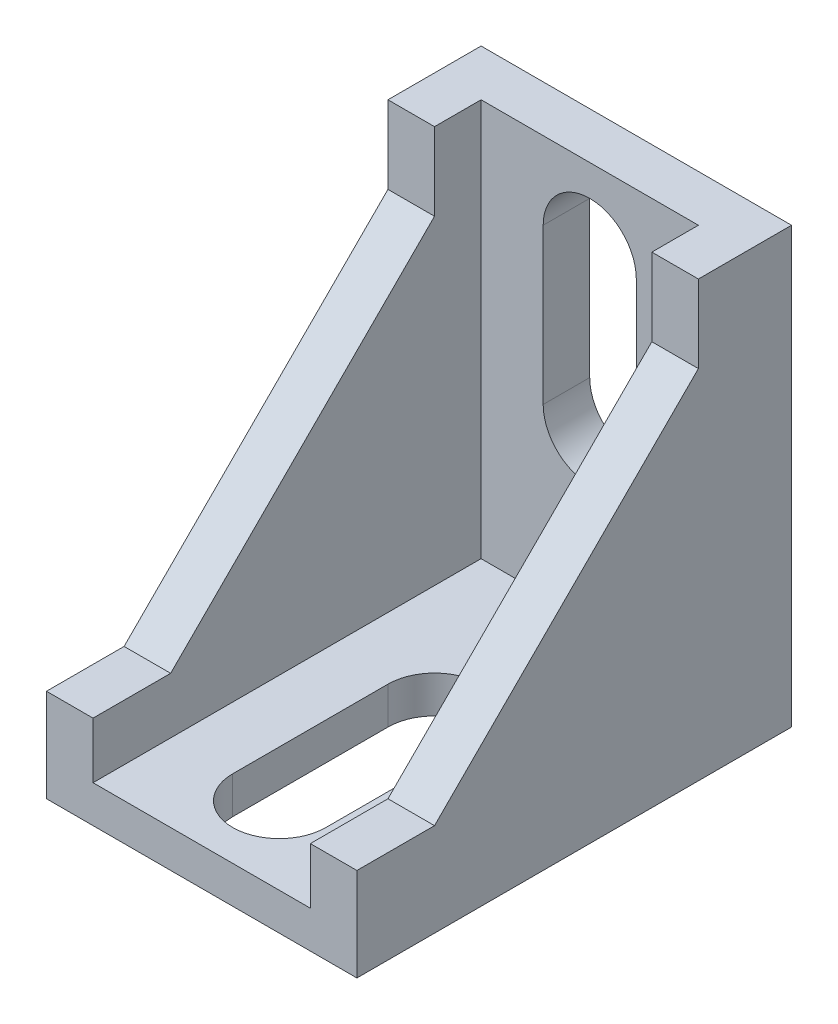
ISO-10303-21;
HEADER;
FILE_DESCRIPTION(('STEP AP214'),'2;1');
FILE_NAME('part.step','',(''),(''),'','','');
FILE_SCHEMA(('AUTOMOTIVE_DESIGN { 1 0 10303 214 1 1 1 1 }'));
ENDSEC;
DATA;
#1=APPLICATION_CONTEXT('core data for automotive mechanical design processes');
#2=APPLICATION_PROTOCOL_DEFINITION('international standard','automotive_design',2000,#1);
#3=PRODUCT_CONTEXT('',#1,'mechanical');
#4=PRODUCT('Part','Part','',(#3));
#5=PRODUCT_RELATED_PRODUCT_CATEGORY('part','',(#4));
#6=PRODUCT_DEFINITION_FORMATION('','',#4);
#7=PRODUCT_DEFINITION_CONTEXT('part definition',#1,'design');
#8=PRODUCT_DEFINITION('design','',#6,#7);
#9=PRODUCT_DEFINITION_SHAPE('','',#8);
#10=(LENGTH_UNIT() NAMED_UNIT(*) SI_UNIT(.MILLI.,.METRE.));
#11=(NAMED_UNIT(*) PLANE_ANGLE_UNIT() SI_UNIT($,.RADIAN.));
#12=(NAMED_UNIT(*) SI_UNIT($,.STERADIAN.) SOLID_ANGLE_UNIT());
#13=UNCERTAINTY_MEASURE_WITH_UNIT(LENGTH_MEASURE(1.E-05),#10,'distance_accuracy_value','');
#14=(GEOMETRIC_REPRESENTATION_CONTEXT(3) GLOBAL_UNCERTAINTY_ASSIGNED_CONTEXT((#13)) GLOBAL_UNIT_ASSIGNED_CONTEXT((#10,
#11,#12)) REPRESENTATION_CONTEXT('',''));
#15=CARTESIAN_POINT('',(0.,0.,0.));
#16=DIRECTION('',(0.,0.,1.));
#17=DIRECTION('',(1.,0.,0.));
#18=AXIS2_PLACEMENT_3D('',#15,#16,#17);
#19=CARTESIAN_POINT('',(-10.,0.,0.));
#20=DIRECTION('',(1.,0.,0.));
#21=DIRECTION('',(0.,1.,0.));
#22=AXIS2_PLACEMENT_3D('',#19,#20,#21);
#23=PLANE('',#22);
#24=DIRECTION('',(0.,-1.,0.));
#25=VECTOR('',#24,1.);
#26=CARTESIAN_POINT('',(-10.,3.,28.));
#27=LINE('',#26,#25);
#28=CARTESIAN_POINT('',(-10.,6.,28.));
#29=VERTEX_POINT('',#28);
#30=CARTESIAN_POINT('',(-10.,0.,28.));
#31=VERTEX_POINT('',#30);
#32=EDGE_CURVE('E315',#29,#31,#27,.T.);
#33=ORIENTED_EDGE('',*,*,#32,.F.);
#34=DIRECTION('',(0.,0.,1.));
#35=VECTOR('',#34,1.);
#36=CARTESIAN_POINT('',(-10.,6.,25.5));
#37=LINE('',#36,#35);
#38=CARTESIAN_POINT('',(-10.,6.,23.));
#39=VERTEX_POINT('',#38);
#40=EDGE_CURVE('E40',#39,#29,#37,.T.);
#41=ORIENTED_EDGE('',*,*,#40,.F.);
#42=DIRECTION('',(0.,-0.707106781186548,0.707106781186548));
#43=VECTOR('',#42,1.);
#44=CARTESIAN_POINT('',(-10.,14.5,14.5));
#45=LINE('',#44,#43);
#46=CARTESIAN_POINT('',(-10.,23.,6.));
#47=VERTEX_POINT('',#46);
#48=EDGE_CURVE('E293',#47,#39,#45,.T.);
#49=ORIENTED_EDGE('',*,*,#48,.F.);
#50=DIRECTION('',(0.,-1.,0.));
#51=VECTOR('',#50,1.);
#52=CARTESIAN_POINT('',(-10.,25.5,6.));
#53=LINE('',#52,#51);
#54=CARTESIAN_POINT('',(-10.,28.,6.));
#55=VERTEX_POINT('',#54);
#56=EDGE_CURVE('E302',#55,#47,#53,.T.);
#57=ORIENTED_EDGE('',*,*,#56,.F.);
#58=DIRECTION('',(0.,0.,1.));
#59=VECTOR('',#58,1.);
#60=CARTESIAN_POINT('',(-10.,28.,3.));
#61=LINE('',#60,#59);
#62=CARTESIAN_POINT('',(-10.,28.,0.));
#63=VERTEX_POINT('',#62);
#64=EDGE_CURVE('E265',#63,#55,#61,.T.);
#65=ORIENTED_EDGE('',*,*,#64,.F.);
#66=DIRECTION('',(0.,1.,0.));
#67=VECTOR('',#66,1.);
#68=CARTESIAN_POINT('',(-10.,14.,0.));
#69=LINE('',#68,#67);
#70=CARTESIAN_POINT('',(-10.,0.,0.));
#71=VERTEX_POINT('',#70);
#72=EDGE_CURVE('E336',#71,#63,#69,.T.);
#73=ORIENTED_EDGE('',*,*,#72,.F.);
#74=DIRECTION('',(0.,0.,-1.));
#75=VECTOR('',#74,1.);
#76=CARTESIAN_POINT('',(-10.,0.,14.));
#77=LINE('',#76,#75);
#78=EDGE_CURVE('E273',#31,#71,#77,.T.);
#79=ORIENTED_EDGE('',*,*,#78,.F.);
#80=EDGE_LOOP('',(#33,#41,#49,#57,#65,#73,#79));
#81=FACE_BOUND('',#80,.T.);
#82=ADVANCED_FACE('F15',(#81),#23,.F.);
#83=CARTESIAN_POINT('',(10.,0.,0.));
#84=DIRECTION('',(1.,0.,0.));
#85=DIRECTION('',(0.,1.,0.));
#86=AXIS2_PLACEMENT_3D('',#83,#84,#85);
#87=PLANE('',#86);
#88=DIRECTION('',(0.,0.,-1.));
#89=VECTOR('',#88,1.);
#90=CARTESIAN_POINT('',(10.,0.,14.));
#91=LINE('',#90,#89);
#92=CARTESIAN_POINT('',(10.,0.,28.));
#93=VERTEX_POINT('',#92);
#94=CARTESIAN_POINT('',(10.,0.,0.));
#95=VERTEX_POINT('',#94);
#96=EDGE_CURVE('E10',#93,#95,#91,.T.);
#97=ORIENTED_EDGE('',*,*,#96,.T.);
#98=DIRECTION('',(0.,1.,0.));
#99=VECTOR('',#98,1.);
#100=CARTESIAN_POINT('',(10.,14.,0.));
#101=LINE('',#100,#99);
#102=CARTESIAN_POINT('',(10.,28.,0.));
#103=VERTEX_POINT('',#102);
#104=EDGE_CURVE('E26',#95,#103,#101,.T.);
#105=ORIENTED_EDGE('',*,*,#104,.T.);
#106=DIRECTION('',(0.,0.,1.));
#107=VECTOR('',#106,1.);
#108=CARTESIAN_POINT('',(10.,28.,3.));
#109=LINE('',#108,#107);
#110=CARTESIAN_POINT('',(10.,28.,6.));
#111=VERTEX_POINT('',#110);
#112=EDGE_CURVE('E291',#103,#111,#109,.T.);
#113=ORIENTED_EDGE('',*,*,#112,.T.);
#114=DIRECTION('',(0.,-1.,0.));
#115=VECTOR('',#114,1.);
#116=CARTESIAN_POINT('',(10.,25.5,6.));
#117=LINE('',#116,#115);
#118=CARTESIAN_POINT('',(10.,23.,6.));
#119=VERTEX_POINT('',#118);
#120=EDGE_CURVE('E287',#111,#119,#117,.T.);
#121=ORIENTED_EDGE('',*,*,#120,.T.);
#122=DIRECTION('',(0.,-0.707106781186548,0.707106781186548));
#123=VECTOR('',#122,1.);
#124=CARTESIAN_POINT('',(10.,14.5,14.5));
#125=LINE('',#124,#123);
#126=CARTESIAN_POINT('',(10.,6.,23.));
#127=VERTEX_POINT('',#126);
#128=EDGE_CURVE('E292',#119,#127,#125,.T.);
#129=ORIENTED_EDGE('',*,*,#128,.T.);
#130=DIRECTION('',(0.,0.,1.));
#131=VECTOR('',#130,1.);
#132=CARTESIAN_POINT('',(10.,6.,25.5));
#133=LINE('',#132,#131);
#134=CARTESIAN_POINT('',(10.,6.,28.));
#135=VERTEX_POINT('',#134);
#136=EDGE_CURVE('E372',#127,#135,#133,.T.);
#137=ORIENTED_EDGE('',*,*,#136,.T.);
#138=DIRECTION('',(0.,-1.,0.));
#139=VECTOR('',#138,1.);
#140=CARTESIAN_POINT('',(10.,3.,28.));
#141=LINE('',#140,#139);
#142=EDGE_CURVE('E358',#135,#93,#141,.T.);
#143=ORIENTED_EDGE('',*,*,#142,.T.);
#144=EDGE_LOOP('',(#97,#105,#113,#121,#129,#137,#143));
#145=FACE_BOUND('',#144,.T.);
#146=ADVANCED_FACE('F386',(#145),#87,.T.);
#147=CARTESIAN_POINT('',(0.,6.,28.));
#148=DIRECTION('',(0.,0.,1.));
#149=DIRECTION('',(1.,0.,0.));
#150=AXIS2_PLACEMENT_3D('',#147,#148,#149);
#151=PLANE('',#150);
#152=DIRECTION('',(1.,0.,0.));
#153=VECTOR('',#152,1.);
#154=CARTESIAN_POINT('',(-8.5,6.,28.));
#155=LINE('',#154,#153);
#156=CARTESIAN_POINT('',(-7.,6.,28.));
#157=VERTEX_POINT('',#156);
#158=EDGE_CURVE('E272',#29,#157,#155,.T.);
#159=ORIENTED_EDGE('',*,*,#158,.F.);
#160=ORIENTED_EDGE('',*,*,#32,.T.);
#161=DIRECTION('',(1.,0.,0.));
#162=VECTOR('',#161,1.);
#163=CARTESIAN_POINT('',(0.,0.,28.));
#164=LINE('',#163,#162);
#165=EDGE_CURVE('E271',#31,#93,#164,.T.);
#166=ORIENTED_EDGE('',*,*,#165,.T.);
#167=ORIENTED_EDGE('',*,*,#142,.F.);
#168=DIRECTION('',(1.,0.,0.));
#169=VECTOR('',#168,1.);
#170=CARTESIAN_POINT('',(8.5,6.,28.));
#171=LINE('',#170,#169);
#172=CARTESIAN_POINT('',(7.,6.,28.));
#173=VERTEX_POINT('',#172);
#174=EDGE_CURVE('E364',#173,#135,#171,.T.);
#175=ORIENTED_EDGE('',*,*,#174,.F.);
#176=DIRECTION('',(0.,1.,0.));
#177=VECTOR('',#176,1.);
#178=CARTESIAN_POINT('',(7.,4.19772658937,28.));
#179=LINE('',#178,#177);
#180=CARTESIAN_POINT('',(7.,2.39545317873,28.));
#181=VERTEX_POINT('',#180);
#182=EDGE_CURVE('E403',#181,#173,#179,.T.);
#183=ORIENTED_EDGE('',*,*,#182,.F.);
#184=DIRECTION('',(1.,0.,0.));
#185=VECTOR('',#184,1.);
#186=CARTESIAN_POINT('',(0.,2.39545317873,28.));
#187=LINE('',#186,#185);
#188=CARTESIAN_POINT('',(-7.,2.39545317873,28.));
#189=VERTEX_POINT('',#188);
#190=EDGE_CURVE('E326',#189,#181,#187,.T.);
#191=ORIENTED_EDGE('',*,*,#190,.F.);
#192=DIRECTION('',(0.,-1.,0.));
#193=VECTOR('',#192,1.);
#194=CARTESIAN_POINT('',(-7.,4.19772658937,28.));
#195=LINE('',#194,#193);
#196=EDGE_CURVE('E363',#157,#189,#195,.T.);
#197=ORIENTED_EDGE('',*,*,#196,.F.);
#198=EDGE_LOOP('',(#159,#160,#166,#167,#175,#183,#191,#197));
#199=FACE_BOUND('',#198,.T.);
#200=ADVANCED_FACE('F402',(#199),#151,.T.);
#201=CARTESIAN_POINT('',(0.,6.,23.));
#202=DIRECTION('',(0.,1.,0.));
#203=DIRECTION('',(1.,0.,0.));
#204=AXIS2_PLACEMENT_3D('',#201,#202,#203);
#205=PLANE('',#204);
#206=DIRECTION('',(1.,0.,0.));
#207=VECTOR('',#206,1.);
#208=CARTESIAN_POINT('',(-8.5,6.,23.));
#209=LINE('',#208,#207);
#210=CARTESIAN_POINT('',(-7.,6.,23.));
#211=VERTEX_POINT('',#210);
#212=EDGE_CURVE('E297',#39,#211,#209,.T.);
#213=ORIENTED_EDGE('',*,*,#212,.F.);
#214=ORIENTED_EDGE('',*,*,#40,.T.);
#215=ORIENTED_EDGE('',*,*,#158,.T.);
#216=DIRECTION('',(0.,0.,-1.));
#217=VECTOR('',#216,1.);
#218=CARTESIAN_POINT('',(-7.,6.,25.5));
#219=LINE('',#218,#217);
#220=EDGE_CURVE('E19',#157,#211,#219,.T.);
#221=ORIENTED_EDGE('',*,*,#220,.T.);
#222=EDGE_LOOP('',(#213,#214,#215,#221));
#223=FACE_BOUND('',#222,.T.);
#224=ADVANCED_FACE('F516',(#223),#205,.T.);
#225=CARTESIAN_POINT('',(0.,6.,23.));
#226=DIRECTION('',(0.,1.,0.));
#227=DIRECTION('',(1.,0.,0.));
#228=AXIS2_PLACEMENT_3D('',#225,#226,#227);
#229=PLANE('',#228);
#230=ORIENTED_EDGE('',*,*,#174,.T.);
#231=ORIENTED_EDGE('',*,*,#136,.F.);
#232=DIRECTION('',(1.,0.,0.));
#233=VECTOR('',#232,1.);
#234=CARTESIAN_POINT('',(8.5,6.,23.));
#235=LINE('',#234,#233);
#236=CARTESIAN_POINT('',(7.,6.,23.));
#237=VERTEX_POINT('',#236);
#238=EDGE_CURVE('E298',#237,#127,#235,.T.);
#239=ORIENTED_EDGE('',*,*,#238,.F.);
#240=DIRECTION('',(0.,0.,-1.));
#241=VECTOR('',#240,1.);
#242=CARTESIAN_POINT('',(7.,6.,25.5));
#243=LINE('',#242,#241);
#244=EDGE_CURVE('E397',#173,#237,#243,.T.);
#245=ORIENTED_EDGE('',*,*,#244,.F.);
#246=EDGE_LOOP('',(#230,#231,#239,#245));
#247=FACE_BOUND('',#246,.T.);
#248=ADVANCED_FACE('F396',(#247),#229,.T.);
#249=CARTESIAN_POINT('',(0.,6.,23.));
#250=DIRECTION('',(0.,-0.707106781186548,-0.707106781186548));
#251=DIRECTION('',(0.,-0.707106781186548,0.707106781186548));
#252=AXIS2_PLACEMENT_3D('',#249,#250,#251);
#253=PLANE('',#252);
#254=DIRECTION('',(0.,0.707106781186548,-0.707106781186548));
#255=VECTOR('',#254,1.);
#256=CARTESIAN_POINT('',(-7.,14.5,14.5));
#257=LINE('',#256,#255);
#258=CARTESIAN_POINT('',(-7.,23.,6.));
#259=VERTEX_POINT('',#258);
#260=EDGE_CURVE('E296',#211,#259,#257,.T.);
#261=ORIENTED_EDGE('',*,*,#260,.T.);
#262=DIRECTION('',(1.,0.,0.));
#263=VECTOR('',#262,1.);
#264=CARTESIAN_POINT('',(-8.5,23.,6.));
#265=LINE('',#264,#263);
#266=EDGE_CURVE('E330',#47,#259,#265,.T.);
#267=ORIENTED_EDGE('',*,*,#266,.F.);
#268=ORIENTED_EDGE('',*,*,#48,.T.);
#269=ORIENTED_EDGE('',*,*,#212,.T.);
#270=EDGE_LOOP('',(#261,#267,#268,#269));
#271=FACE_BOUND('',#270,.T.);
#272=ADVANCED_FACE('F519',(#271),#253,.F.);
#273=CARTESIAN_POINT('',(0.,6.,23.));
#274=DIRECTION('',(0.,-0.707106781186548,-0.707106781186548));
#275=DIRECTION('',(0.,-0.707106781186548,0.707106781186548));
#276=AXIS2_PLACEMENT_3D('',#273,#274,#275);
#277=PLANE('',#276);
#278=DIRECTION('',(0.,0.707106781186548,-0.707106781186548));
#279=VECTOR('',#278,1.);
#280=CARTESIAN_POINT('',(7.,14.5,14.5));
#281=LINE('',#280,#279);
#282=CARTESIAN_POINT('',(7.,23.,6.));
#283=VERTEX_POINT('',#282);
#284=EDGE_CURVE('E362',#237,#283,#281,.T.);
#285=ORIENTED_EDGE('',*,*,#284,.F.);
#286=ORIENTED_EDGE('',*,*,#238,.T.);
#287=ORIENTED_EDGE('',*,*,#128,.F.);
#288=DIRECTION('',(1.,0.,0.));
#289=VECTOR('',#288,1.);
#290=CARTESIAN_POINT('',(8.5,23.,6.));
#291=LINE('',#290,#289);
#292=EDGE_CURVE('E286',#283,#119,#291,.T.);
#293=ORIENTED_EDGE('',*,*,#292,.F.);
#294=EDGE_LOOP('',(#285,#286,#287,#293));
#295=FACE_BOUND('',#294,.T.);
#296=ADVANCED_FACE('F393',(#295),#277,.F.);
#297=CARTESIAN_POINT('',(0.,28.,6.));
#298=DIRECTION('',(0.,0.,1.));
#299=DIRECTION('',(1.,0.,0.));
#300=AXIS2_PLACEMENT_3D('',#297,#298,#299);
#301=PLANE('',#300);
#302=DIRECTION('',(1.,0.,0.));
#303=VECTOR('',#302,1.);
#304=CARTESIAN_POINT('',(-8.5,28.,6.));
#305=LINE('',#304,#303);
#306=CARTESIAN_POINT('',(-7.,28.,6.));
#307=VERTEX_POINT('',#306);
#308=EDGE_CURVE('E268',#55,#307,#305,.T.);
#309=ORIENTED_EDGE('',*,*,#308,.F.);
#310=ORIENTED_EDGE('',*,*,#56,.T.);
#311=ORIENTED_EDGE('',*,*,#266,.T.);
#312=DIRECTION('',(0.,-1.,0.));
#313=VECTOR('',#312,1.);
#314=CARTESIAN_POINT('',(-7.,25.5,6.));
#315=LINE('',#314,#313);
#316=EDGE_CURVE('E329',#307,#259,#315,.T.);
#317=ORIENTED_EDGE('',*,*,#316,.F.);
#318=EDGE_LOOP('',(#309,#310,#311,#317));
#319=FACE_BOUND('',#318,.T.);
#320=ADVANCED_FACE('F557',(#319),#301,.T.);
#321=CARTESIAN_POINT('',(0.,28.,6.));
#322=DIRECTION('',(0.,0.,1.));
#323=DIRECTION('',(1.,0.,0.));
#324=AXIS2_PLACEMENT_3D('',#321,#322,#323);
#325=PLANE('',#324);
#326=ORIENTED_EDGE('',*,*,#292,.T.);
#327=ORIENTED_EDGE('',*,*,#120,.F.);
#328=DIRECTION('',(1.,0.,0.));
#329=VECTOR('',#328,1.);
#330=CARTESIAN_POINT('',(8.5,28.,6.));
#331=LINE('',#330,#329);
#332=CARTESIAN_POINT('',(7.,28.,6.));
#333=VERTEX_POINT('',#332);
#334=EDGE_CURVE('E267',#333,#111,#331,.T.);
#335=ORIENTED_EDGE('',*,*,#334,.F.);
#336=DIRECTION('',(0.,-1.,0.));
#337=VECTOR('',#336,1.);
#338=CARTESIAN_POINT('',(7.,25.5,6.));
#339=LINE('',#338,#337);
#340=EDGE_CURVE('E282',#333,#283,#339,.T.);
#341=ORIENTED_EDGE('',*,*,#340,.T.);
#342=EDGE_LOOP('',(#326,#327,#335,#341));
#343=FACE_BOUND('',#342,.T.);
#344=ADVANCED_FACE('F499',(#343),#325,.T.);
#345=CARTESIAN_POINT('',(0.,28.,0.));
#346=DIRECTION('',(0.,1.,0.));
#347=DIRECTION('',(1.,0.,0.));
#348=AXIS2_PLACEMENT_3D('',#345,#346,#347);
#349=PLANE('',#348);
#350=ORIENTED_EDGE('',*,*,#334,.T.);
#351=ORIENTED_EDGE('',*,*,#112,.F.);
#352=DIRECTION('',(1.,0.,0.));
#353=VECTOR('',#352,1.);
#354=CARTESIAN_POINT('',(0.,28.,0.));
#355=LINE('',#354,#353);
#356=EDGE_CURVE('E339',#63,#103,#355,.T.);
#357=ORIENTED_EDGE('',*,*,#356,.F.);
#358=ORIENTED_EDGE('',*,*,#64,.T.);
#359=ORIENTED_EDGE('',*,*,#308,.T.);
#360=DIRECTION('',(0.,0.,-1.));
#361=VECTOR('',#360,1.);
#362=CARTESIAN_POINT('',(-7.,28.,4.5));
#363=LINE('',#362,#361);
#364=CARTESIAN_POINT('',(-7.,28.,3.));
#365=VERTEX_POINT('',#364);
#366=EDGE_CURVE('E435',#307,#365,#363,.T.);
#367=ORIENTED_EDGE('',*,*,#366,.T.);
#368=DIRECTION('',(1.,0.,0.));
#369=VECTOR('',#368,1.);
#370=CARTESIAN_POINT('',(0.,28.,3.));
#371=LINE('',#370,#369);
#372=CARTESIAN_POINT('',(7.,28.,3.));
#373=VERTEX_POINT('',#372);
#374=EDGE_CURVE('E431',#365,#373,#371,.T.);
#375=ORIENTED_EDGE('',*,*,#374,.T.);
#376=DIRECTION('',(0.,0.,-1.));
#377=VECTOR('',#376,1.);
#378=CARTESIAN_POINT('',(7.,28.,4.5));
#379=LINE('',#378,#377);
#380=EDGE_CURVE('E359',#333,#373,#379,.T.);
#381=ORIENTED_EDGE('',*,*,#380,.F.);
#382=EDGE_LOOP('',(#350,#351,#357,#358,#359,#367,#375,#381));
#383=FACE_BOUND('',#382,.T.);
#384=ADVANCED_FACE('F494',(#383),#349,.T.);
#385=CARTESIAN_POINT('',(7.,2.39545317873,28.));
#386=DIRECTION('',(-1.,0.,0.));
#387=DIRECTION('',(0.,0.,1.));
#388=AXIS2_PLACEMENT_3D('',#385,#386,#387);
#389=PLANE('',#388);
#390=DIRECTION('',(0.,1.,0.));
#391=VECTOR('',#390,1.);
#392=CARTESIAN_POINT('',(7.,15.1977265894,3.));
#393=LINE('',#392,#391);
#394=CARTESIAN_POINT('',(7.,2.39545317873,3.));
#395=VERTEX_POINT('',#394);
#396=EDGE_CURVE('E323',#395,#373,#393,.T.);
#397=ORIENTED_EDGE('',*,*,#396,.F.);
#398=DIRECTION('',(0.,0.,-1.));
#399=VECTOR('',#398,1.);
#400=CARTESIAN_POINT('',(7.,2.39545317873,15.5));
#401=LINE('',#400,#399);
#402=EDGE_CURVE('E247',#181,#395,#401,.T.);
#403=ORIENTED_EDGE('',*,*,#402,.F.);
#404=ORIENTED_EDGE('',*,*,#182,.T.);
#405=ORIENTED_EDGE('',*,*,#244,.T.);
#406=ORIENTED_EDGE('',*,*,#284,.T.);
#407=ORIENTED_EDGE('',*,*,#340,.F.);
#408=ORIENTED_EDGE('',*,*,#380,.T.);
#409=EDGE_LOOP('',(#397,#403,#404,#405,#406,#407,#408));
#410=FACE_BOUND('',#409,.T.);
#411=ADVANCED_FACE('F501',(#410),#389,.T.);
#412=CARTESIAN_POINT('',(-7.,29.6509940197,28.));
#413=DIRECTION('',(1.,0.,0.));
#414=DIRECTION('',(0.,1.,0.));
#415=AXIS2_PLACEMENT_3D('',#412,#413,#414);
#416=PLANE('',#415);
#417=ORIENTED_EDGE('',*,*,#196,.T.);
#418=DIRECTION('',(0.,0.,-1.));
#419=VECTOR('',#418,1.);
#420=CARTESIAN_POINT('',(-7.,2.39545317873,15.5));
#421=LINE('',#420,#419);
#422=CARTESIAN_POINT('',(-7.,2.39545317873,3.));
#423=VERTEX_POINT('',#422);
#424=EDGE_CURVE('E368',#189,#423,#421,.T.);
#425=ORIENTED_EDGE('',*,*,#424,.T.);
#426=DIRECTION('',(0.,-1.,0.));
#427=VECTOR('',#426,1.);
#428=CARTESIAN_POINT('',(-7.,15.1977265894,3.));
#429=LINE('',#428,#427);
#430=EDGE_CURVE('E308',#365,#423,#429,.T.);
#431=ORIENTED_EDGE('',*,*,#430,.F.);
#432=ORIENTED_EDGE('',*,*,#366,.F.);
#433=ORIENTED_EDGE('',*,*,#316,.T.);
#434=ORIENTED_EDGE('',*,*,#260,.F.);
#435=ORIENTED_EDGE('',*,*,#220,.F.);
#436=EDGE_LOOP('',(#417,#425,#431,#432,#433,#434,#435));
#437=FACE_BOUND('',#436,.T.);
#438=ADVANCED_FACE('F512',(#437),#416,.T.);
#439=CARTESIAN_POINT('',(7.,2.39545317873,28.));
#440=DIRECTION('',(0.,-1.,0.));
#441=DIRECTION('',(0.,0.,-1.));
#442=AXIS2_PLACEMENT_3D('',#439,#440,#441);
#443=PLANE('',#442);
#444=ORIENTED_EDGE('',*,*,#424,.F.);
#445=ORIENTED_EDGE('',*,*,#190,.T.);
#446=ORIENTED_EDGE('',*,*,#402,.T.);
#447=DIRECTION('',(1.,0.,0.));
#448=VECTOR('',#447,1.);
#449=CARTESIAN_POINT('',(0.,2.39545317873,3.));
#450=LINE('',#449,#448);
#451=EDGE_CURVE('E311',#423,#395,#450,.T.);
#452=ORIENTED_EDGE('',*,*,#451,.F.);
#453=EDGE_LOOP('',(#444,#445,#446,#452));
#454=FACE_BOUND('',#453,.T.);
#455=DIRECTION('',(0.,0.,-1.));
#456=VECTOR('',#455,1.);
#457=CARTESIAN_POINT('',(3.,2.39545317873,18.));
#458=LINE('',#457,#456);
#459=CARTESIAN_POINT('',(3.,2.39545317873,23.));
#460=VERTEX_POINT('',#459);
#461=CARTESIAN_POINT('',(3.,2.39545317873,13.));
#462=VERTEX_POINT('',#461);
#463=EDGE_CURVE('E224',#460,#462,#458,.T.);
#464=ORIENTED_EDGE('',*,*,#463,.F.);
#465=CARTESIAN_POINT('',(0.,2.39545317873,23.));
#466=DIRECTION('',(0.,-1.,0.));
#467=DIRECTION('',(1.,0.,0.));
#468=AXIS2_PLACEMENT_3D('',#465,#466,#467);
#469=CIRCLE('',#468,3.);
#470=CARTESIAN_POINT('',(-3.,2.39545317873,23.));
#471=VERTEX_POINT('',#470);
#472=EDGE_CURVE('E227',#460,#471,#469,.T.);
#473=ORIENTED_EDGE('',*,*,#472,.T.);
#474=DIRECTION('',(0.,0.,1.));
#475=VECTOR('',#474,1.);
#476=CARTESIAN_POINT('',(-3.,2.39545317873,18.));
#477=LINE('',#476,#475);
#478=CARTESIAN_POINT('',(-3.,2.39545317873,13.));
#479=VERTEX_POINT('',#478);
#480=EDGE_CURVE('E280',#479,#471,#477,.T.);
#481=ORIENTED_EDGE('',*,*,#480,.F.);
#482=CARTESIAN_POINT('',(0.,2.39545317873,13.));
#483=DIRECTION('',(0.,-1.,0.));
#484=DIRECTION('',(1.,0.,0.));
#485=AXIS2_PLACEMENT_3D('',#482,#483,#484);
#486=CIRCLE('',#485,3.);
#487=EDGE_CURVE('E230',#479,#462,#486,.T.);
#488=ORIENTED_EDGE('',*,*,#487,.T.);
#489=EDGE_LOOP('',(#464,#473,#481,#488));
#490=FACE_BOUND('',#489,.T.);
#491=ADVANCED_FACE('F226',(#454,#490),#443,.F.);
#492=CARTESIAN_POINT('',(0.,0.,28.));
#493=DIRECTION('',(0.,-1.,0.));
#494=DIRECTION('',(0.,0.,-1.));
#495=AXIS2_PLACEMENT_3D('',#492,#493,#494);
#496=PLANE('',#495);
#497=ORIENTED_EDGE('',*,*,#165,.F.);
#498=ORIENTED_EDGE('',*,*,#78,.T.);
#499=DIRECTION('',(1.,0.,0.));
#500=VECTOR('',#499,1.);
#501=CARTESIAN_POINT('',(0.,0.,0.));
#502=LINE('',#501,#500);
#503=EDGE_CURVE('E236',#71,#95,#502,.T.);
#504=ORIENTED_EDGE('',*,*,#503,.T.);
#505=ORIENTED_EDGE('',*,*,#96,.F.);
#506=EDGE_LOOP('',(#497,#498,#504,#505));
#507=FACE_BOUND('',#506,.T.);
#508=CARTESIAN_POINT('',(0.,0.,13.));
#509=DIRECTION('',(0.,-1.,0.));
#510=DIRECTION('',(1.,0.,0.));
#511=AXIS2_PLACEMENT_3D('',#508,#509,#510);
#512=CIRCLE('',#511,3.);
#513=CARTESIAN_POINT('',(-3.,0.,13.));
#514=VERTEX_POINT('',#513);
#515=CARTESIAN_POINT('',(3.,0.,13.));
#516=VERTEX_POINT('',#515);
#517=EDGE_CURVE('E319',#514,#516,#512,.T.);
#518=ORIENTED_EDGE('',*,*,#517,.F.);
#519=DIRECTION('',(0.,0.,-1.));
#520=VECTOR('',#519,1.);
#521=CARTESIAN_POINT('',(-3.,0.,18.));
#522=LINE('',#521,#520);
#523=CARTESIAN_POINT('',(-3.,0.,23.));
#524=VERTEX_POINT('',#523);
#525=EDGE_CURVE('E277',#524,#514,#522,.T.);
#526=ORIENTED_EDGE('',*,*,#525,.F.);
#527=CARTESIAN_POINT('',(0.,0.,23.));
#528=DIRECTION('',(0.,-1.,0.));
#529=DIRECTION('',(1.,0.,0.));
#530=AXIS2_PLACEMENT_3D('',#527,#528,#529);
#531=CIRCLE('',#530,3.);
#532=CARTESIAN_POINT('',(3.,0.,23.));
#533=VERTEX_POINT('',#532);
#534=EDGE_CURVE('E253',#533,#524,#531,.T.);
#535=ORIENTED_EDGE('',*,*,#534,.F.);
#536=DIRECTION('',(0.,0.,1.));
#537=VECTOR('',#536,1.);
#538=CARTESIAN_POINT('',(3.,0.,18.));
#539=LINE('',#538,#537);
#540=EDGE_CURVE('E237',#516,#533,#539,.T.);
#541=ORIENTED_EDGE('',*,*,#540,.F.);
#542=EDGE_LOOP('',(#518,#526,#535,#541));
#543=FACE_BOUND('',#542,.T.);
#544=ADVANCED_FACE('F523',(#507,#543),#496,.T.);
#545=CARTESIAN_POINT('',(3.,0.,23.));
#546=DIRECTION('',(1.,0.,0.));
#547=DIRECTION('',(0.,1.,0.));
#548=AXIS2_PLACEMENT_3D('',#545,#546,#547);
#549=PLANE('',#548);
#550=ORIENTED_EDGE('',*,*,#463,.T.);
#551=DIRECTION('',(0.,1.,0.));
#552=VECTOR('',#551,1.);
#553=CARTESIAN_POINT('',(3.,1.19772658937,13.));
#554=LINE('',#553,#552);
#555=EDGE_CURVE('E316',#516,#462,#554,.T.);
#556=ORIENTED_EDGE('',*,*,#555,.F.);
#557=ORIENTED_EDGE('',*,*,#540,.T.);
#558=DIRECTION('',(0.,1.,0.));
#559=VECTOR('',#558,1.);
#560=CARTESIAN_POINT('',(3.,1.19772658937,23.));
#561=LINE('',#560,#559);
#562=EDGE_CURVE('E243',#533,#460,#561,.T.);
#563=ORIENTED_EDGE('',*,*,#562,.T.);
#564=EDGE_LOOP('',(#550,#556,#557,#563));
#565=FACE_BOUND('',#564,.T.);
#566=ADVANCED_FACE('F250',(#565),#549,.F.);
#567=CARTESIAN_POINT('',(0.,12.5,23.));
#568=DIRECTION('',(0.,-1.,0.));
#569=DIRECTION('',(1.,0.,0.));
#570=AXIS2_PLACEMENT_3D('',#567,#568,#569);
#571=CYLINDRICAL_SURFACE('',#570,3.);
#572=ORIENTED_EDGE('',*,*,#472,.F.);
#573=ORIENTED_EDGE('',*,*,#562,.F.);
#574=ORIENTED_EDGE('',*,*,#534,.T.);
#575=DIRECTION('',(0.,1.,0.));
#576=VECTOR('',#575,1.);
#577=CARTESIAN_POINT('',(-3.,12.5,23.));
#578=LINE('',#577,#576);
#579=EDGE_CURVE('E245',#524,#471,#578,.T.);
#580=ORIENTED_EDGE('',*,*,#579,.T.);
#581=EDGE_LOOP('',(#572,#573,#574,#580));
#582=FACE_BOUND('',#581,.T.);
#583=ADVANCED_FACE('F241',(#582),#571,.F.);
#584=CARTESIAN_POINT('',(0.,12.5,13.));
#585=DIRECTION('',(0.,-1.,0.));
#586=DIRECTION('',(-1.,0.,0.));
#587=AXIS2_PLACEMENT_3D('',#584,#585,#586);
#588=CYLINDRICAL_SURFACE('',#587,3.);
#589=ORIENTED_EDGE('',*,*,#487,.F.);
#590=DIRECTION('',(0.,1.,0.));
#591=VECTOR('',#590,1.);
#592=CARTESIAN_POINT('',(-3.,12.5,13.));
#593=LINE('',#592,#591);
#594=EDGE_CURVE('E281',#514,#479,#593,.T.);
#595=ORIENTED_EDGE('',*,*,#594,.F.);
#596=ORIENTED_EDGE('',*,*,#517,.T.);
#597=ORIENTED_EDGE('',*,*,#555,.T.);
#598=EDGE_LOOP('',(#589,#595,#596,#597));
#599=FACE_BOUND('',#598,.T.);
#600=ADVANCED_FACE('F532',(#599),#588,.F.);
#601=CARTESIAN_POINT('',(-3.,0.,13.));
#602=DIRECTION('',(-1.,0.,0.));
#603=DIRECTION('',(0.,0.,1.));
#604=AXIS2_PLACEMENT_3D('',#601,#602,#603);
#605=PLANE('',#604);
#606=ORIENTED_EDGE('',*,*,#480,.T.);
#607=ORIENTED_EDGE('',*,*,#579,.F.);
#608=ORIENTED_EDGE('',*,*,#525,.T.);
#609=ORIENTED_EDGE('',*,*,#594,.T.);
#610=EDGE_LOOP('',(#606,#607,#608,#609));
#611=FACE_BOUND('',#610,.T.);
#612=ADVANCED_FACE('F534',(#611),#605,.F.);
#613=CARTESIAN_POINT('',(0.,0.,3.));
#614=DIRECTION('',(0.,0.,1.));
#615=DIRECTION('',(1.,0.,0.));
#616=AXIS2_PLACEMENT_3D('',#613,#614,#615);
#617=PLANE('',#616);
#618=ORIENTED_EDGE('',*,*,#430,.T.);
#619=ORIENTED_EDGE('',*,*,#451,.T.);
#620=ORIENTED_EDGE('',*,*,#396,.T.);
#621=ORIENTED_EDGE('',*,*,#374,.F.);
#622=EDGE_LOOP('',(#618,#619,#620,#621));
#623=FACE_BOUND('',#622,.T.);
#624=CARTESIAN_POINT('',(0.,13.,3.));
#625=DIRECTION('',(0.,0.,1.));
#626=DIRECTION('',(1.,0.,0.));
#627=AXIS2_PLACEMENT_3D('',#624,#625,#626);
#628=CIRCLE('',#627,3.);
#629=CARTESIAN_POINT('',(-3.,13.,3.));
#630=VERTEX_POINT('',#629);
#631=CARTESIAN_POINT('',(3.,13.,3.));
#632=VERTEX_POINT('',#631);
#633=EDGE_CURVE('E136',#630,#632,#628,.T.);
#634=ORIENTED_EDGE('',*,*,#633,.F.);
#635=DIRECTION('',(0.,-1.,0.));
#636=VECTOR('',#635,1.);
#637=CARTESIAN_POINT('',(-3.,18.,3.));
#638=LINE('',#637,#636);
#639=CARTESIAN_POINT('',(-3.,23.,3.));
#640=VERTEX_POINT('',#639);
#641=EDGE_CURVE('E350',#640,#630,#638,.T.);
#642=ORIENTED_EDGE('',*,*,#641,.F.);
#643=CARTESIAN_POINT('',(0.,23.,3.));
#644=DIRECTION('',(0.,0.,1.));
#645=DIRECTION('',(1.,0.,0.));
#646=AXIS2_PLACEMENT_3D('',#643,#644,#645);
#647=CIRCLE('',#646,3.);
#648=CARTESIAN_POINT('',(3.,23.,3.));
#649=VERTEX_POINT('',#648);
#650=EDGE_CURVE('E303',#649,#640,#647,.T.);
#651=ORIENTED_EDGE('',*,*,#650,.F.);
#652=DIRECTION('',(0.,1.,0.));
#653=VECTOR('',#652,1.);
#654=CARTESIAN_POINT('',(3.,18.,3.));
#655=LINE('',#654,#653);
#656=EDGE_CURVE('E347',#632,#649,#655,.T.);
#657=ORIENTED_EDGE('',*,*,#656,.F.);
#658=EDGE_LOOP('',(#634,#642,#651,#657));
#659=FACE_BOUND('',#658,.T.);
#660=ADVANCED_FACE('F507',(#623,#659),#617,.T.);
#661=CARTESIAN_POINT('',(0.,0.,0.));
#662=DIRECTION('',(0.,0.,-1.));
#663=DIRECTION('',(0.,-1.,0.));
#664=AXIS2_PLACEMENT_3D('',#661,#662,#663);
#665=PLANE('',#664);
#666=ORIENTED_EDGE('',*,*,#503,.F.);
#667=ORIENTED_EDGE('',*,*,#72,.T.);
#668=ORIENTED_EDGE('',*,*,#356,.T.);
#669=ORIENTED_EDGE('',*,*,#104,.F.);
#670=EDGE_LOOP('',(#666,#667,#668,#669));
#671=FACE_BOUND('',#670,.T.);
#672=DIRECTION('',(0.,-1.,0.));
#673=VECTOR('',#672,1.);
#674=CARTESIAN_POINT('',(3.,18.,0.));
#675=LINE('',#674,#673);
#676=CARTESIAN_POINT('',(3.,23.,0.));
#677=VERTEX_POINT('',#676);
#678=CARTESIAN_POINT('',(3.,13.,0.));
#679=VERTEX_POINT('',#678);
#680=EDGE_CURVE('E417',#677,#679,#675,.T.);
#681=ORIENTED_EDGE('',*,*,#680,.F.);
#682=CARTESIAN_POINT('',(0.,23.,0.));
#683=DIRECTION('',(0.,0.,-1.));
#684=DIRECTION('',(1.,0.,0.));
#685=AXIS2_PLACEMENT_3D('',#682,#683,#684);
#686=CIRCLE('',#685,3.);
#687=CARTESIAN_POINT('',(-3.,23.,0.));
#688=VERTEX_POINT('',#687);
#689=EDGE_CURVE('E151',#688,#677,#686,.T.);
#690=ORIENTED_EDGE('',*,*,#689,.F.);
#691=DIRECTION('',(0.,-1.,0.));
#692=VECTOR('',#691,1.);
#693=CARTESIAN_POINT('',(-3.,18.,0.));
#694=LINE('',#693,#692);
#695=CARTESIAN_POINT('',(-3.,13.,0.));
#696=VERTEX_POINT('',#695);
#697=EDGE_CURVE('E414',#688,#696,#694,.T.);
#698=ORIENTED_EDGE('',*,*,#697,.T.);
#699=CARTESIAN_POINT('',(0.,13.,0.));
#700=DIRECTION('',(0.,0.,-1.));
#701=DIRECTION('',(1.,0.,0.));
#702=AXIS2_PLACEMENT_3D('',#699,#700,#701);
#703=CIRCLE('',#702,3.);
#704=EDGE_CURVE('E335',#679,#696,#703,.T.);
#705=ORIENTED_EDGE('',*,*,#704,.F.);
#706=EDGE_LOOP('',(#681,#690,#698,#705));
#707=FACE_BOUND('',#706,.T.);
#708=ADVANCED_FACE('F17',(#671,#707),#665,.T.);
#709=CARTESIAN_POINT('',(3.,0.,23.));
#710=DIRECTION('',(1.,0.,0.));
#711=DIRECTION('',(0.,1.,0.));
#712=AXIS2_PLACEMENT_3D('',#709,#710,#711);
#713=PLANE('',#712);
#714=ORIENTED_EDGE('',*,*,#680,.T.);
#715=DIRECTION('',(0.,0.,-1.));
#716=VECTOR('',#715,1.);
#717=CARTESIAN_POINT('',(3.,13.,1.5));
#718=LINE('',#717,#716);
#719=EDGE_CURVE('E342',#632,#679,#718,.T.);
#720=ORIENTED_EDGE('',*,*,#719,.F.);
#721=ORIENTED_EDGE('',*,*,#656,.T.);
#722=DIRECTION('',(0.,0.,-1.));
#723=VECTOR('',#722,1.);
#724=CARTESIAN_POINT('',(3.,23.,1.5));
#725=LINE('',#724,#723);
#726=EDGE_CURVE('E343',#649,#677,#725,.T.);
#727=ORIENTED_EDGE('',*,*,#726,.T.);
#728=EDGE_LOOP('',(#714,#720,#721,#727));
#729=FACE_BOUND('',#728,.T.);
#730=ADVANCED_FACE('F569',(#729),#713,.F.);
#731=CARTESIAN_POINT('',(0.,23.,-9.5));
#732=DIRECTION('',(0.,0.,1.));
#733=DIRECTION('',(1.,0.,0.));
#734=AXIS2_PLACEMENT_3D('',#731,#732,#733);
#735=CYLINDRICAL_SURFACE('',#734,3.);
#736=ORIENTED_EDGE('',*,*,#689,.T.);
#737=ORIENTED_EDGE('',*,*,#726,.F.);
#738=ORIENTED_EDGE('',*,*,#650,.T.);
#739=DIRECTION('',(0.,0.,-1.));
#740=VECTOR('',#739,1.);
#741=CARTESIAN_POINT('',(-3.,23.,-9.5));
#742=LINE('',#741,#740);
#743=EDGE_CURVE('E307',#640,#688,#742,.T.);
#744=ORIENTED_EDGE('',*,*,#743,.T.);
#745=EDGE_LOOP('',(#736,#737,#738,#744));
#746=FACE_BOUND('',#745,.T.);
#747=ADVANCED_FACE('F563',(#746),#735,.F.);
#748=CARTESIAN_POINT('',(0.,13.,-9.5));
#749=DIRECTION('',(0.,0.,1.));
#750=DIRECTION('',(-1.,0.,0.));
#751=AXIS2_PLACEMENT_3D('',#748,#749,#750);
#752=CYLINDRICAL_SURFACE('',#751,3.);
#753=ORIENTED_EDGE('',*,*,#704,.T.);
#754=DIRECTION('',(0.,0.,-1.));
#755=VECTOR('',#754,1.);
#756=CARTESIAN_POINT('',(-3.,13.,-9.5));
#757=LINE('',#756,#755);
#758=EDGE_CURVE('E354',#630,#696,#757,.T.);
#759=ORIENTED_EDGE('',*,*,#758,.F.);
#760=ORIENTED_EDGE('',*,*,#633,.T.);
#761=ORIENTED_EDGE('',*,*,#719,.T.);
#762=EDGE_LOOP('',(#753,#759,#760,#761));
#763=FACE_BOUND('',#762,.T.);
#764=ADVANCED_FACE('F561',(#763),#752,.F.);
#765=CARTESIAN_POINT('',(-3.,0.,13.));
#766=DIRECTION('',(-1.,0.,0.));
#767=DIRECTION('',(0.,0.,1.));
#768=AXIS2_PLACEMENT_3D('',#765,#766,#767);
#769=PLANE('',#768);
#770=ORIENTED_EDGE('',*,*,#697,.F.);
#771=ORIENTED_EDGE('',*,*,#743,.F.);
#772=ORIENTED_EDGE('',*,*,#641,.T.);
#773=ORIENTED_EDGE('',*,*,#758,.T.);
#774=EDGE_LOOP('',(#770,#771,#772,#773));
#775=FACE_BOUND('',#774,.T.);
#776=ADVANCED_FACE('F553',(#775),#769,.F.);
#777=CLOSED_SHELL('',(#82,#146,#200,#224,#248,#272,#296,#320,#344,#384,#411,#438,#491,#544,#566,
#583,#600,#612,#660,#708,#730,#747,#764,#776));
#778=MANIFOLD_SOLID_BREP('B1',#777);
#779=ADVANCED_BREP_SHAPE_REPRESENTATION('',(#18,#778),#14);
#780=SHAPE_DEFINITION_REPRESENTATION(#9,#779);
ENDSEC;
END-ISO-10303-21;
